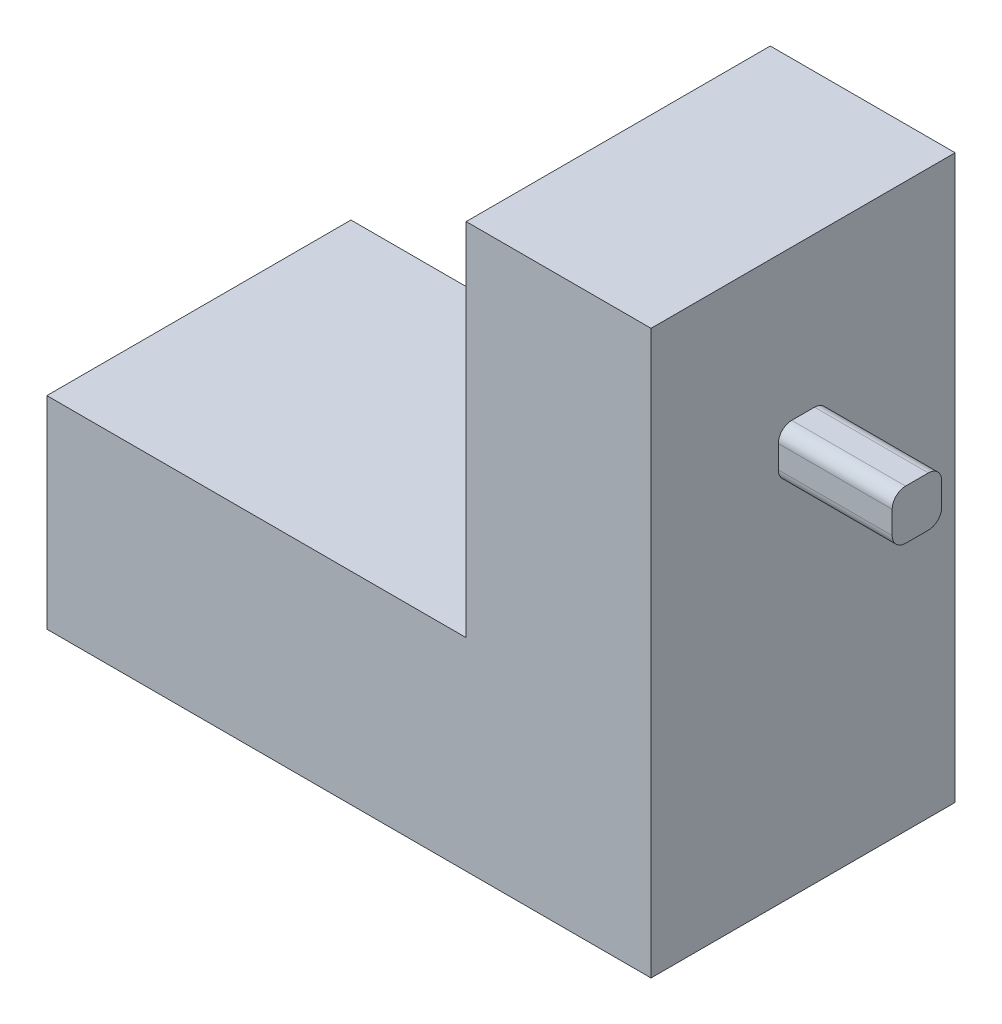
ISO-10303-21;
HEADER;
FILE_DESCRIPTION(('STEP AP214'),'2;1');
FILE_NAME('part.step','',(''),(''),'','','');
FILE_SCHEMA(('AUTOMOTIVE_DESIGN { 1 0 10303 214 1 1 1 1 }'));
ENDSEC;
DATA;
#1=APPLICATION_CONTEXT('core data for automotive mechanical design processes');
#2=APPLICATION_PROTOCOL_DEFINITION('international standard','automotive_design',2000,#1);
#3=PRODUCT_CONTEXT('',#1,'mechanical');
#4=PRODUCT('Part','Part','',(#3));
#5=PRODUCT_RELATED_PRODUCT_CATEGORY('part','',(#4));
#6=PRODUCT_DEFINITION_FORMATION('','',#4);
#7=PRODUCT_DEFINITION_CONTEXT('part definition',#1,'design');
#8=PRODUCT_DEFINITION('design','',#6,#7);
#9=PRODUCT_DEFINITION_SHAPE('','',#8);
#10=(LENGTH_UNIT() NAMED_UNIT(*) SI_UNIT(.MILLI.,.METRE.));
#11=(NAMED_UNIT(*) PLANE_ANGLE_UNIT() SI_UNIT($,.RADIAN.));
#12=(NAMED_UNIT(*) SI_UNIT($,.STERADIAN.) SOLID_ANGLE_UNIT());
#13=UNCERTAINTY_MEASURE_WITH_UNIT(LENGTH_MEASURE(1.E-05),#10,'distance_accuracy_value','');
#14=(GEOMETRIC_REPRESENTATION_CONTEXT(3) GLOBAL_UNCERTAINTY_ASSIGNED_CONTEXT((#13)) GLOBAL_UNIT_ASSIGNED_CONTEXT((#10,
#11,#12)) REPRESENTATION_CONTEXT('',''));
#15=CARTESIAN_POINT('',(0.,0.,0.));
#16=DIRECTION('',(0.,0.,1.));
#17=DIRECTION('',(1.,0.,0.));
#18=AXIS2_PLACEMENT_3D('',#15,#16,#17);
#19=CARTESIAN_POINT('',(-6.94397744138555,25.5552538240955,22.7));
#20=DIRECTION('',(0.,1.,0.));
#21=DIRECTION('',(0.,0.,1.));
#22=AXIS2_PLACEMENT_3D('',#19,#20,#21);
#23=PLANE('',#22);
#24=DIRECTION('',(0.,0.,-1.));
#25=VECTOR('',#24,1.);
#26=CARTESIAN_POINT('',(-6.94397744138555,25.5552538240955,22.7));
#27=LINE('',#26,#25);
#28=CARTESIAN_POINT('',(-6.94397744138555,25.5552538240955,12.2));
#29=VERTEX_POINT('',#28);
#30=CARTESIAN_POINT('',(-6.94397744138555,25.5552538240955,10.5));
#31=VERTEX_POINT('',#30);
#32=EDGE_CURVE('E198',#29,#31,#27,.T.);
#33=ORIENTED_EDGE('',*,*,#32,.T.);
#34=DIRECTION('',(1.,0.,0.));
#35=VECTOR('',#34,1.);
#36=CARTESIAN_POINT('',(-6.94397744138555,25.5552538240955,10.5));
#37=LINE('',#36,#35);
#38=CARTESIAN_POINT('',(1.55602255861446,25.5552538240955,10.5));
#39=VERTEX_POINT('',#38);
#40=EDGE_CURVE('E182',#31,#39,#37,.T.);
#41=ORIENTED_EDGE('',*,*,#40,.T.);
#42=DIRECTION('',(0.,0.,-1.));
#43=VECTOR('',#42,1.);
#44=CARTESIAN_POINT('',(1.55602255861446,25.5552538240955,22.7));
#45=LINE('',#44,#43);
#46=CARTESIAN_POINT('',(1.55602255861446,25.5552538240955,12.2));
#47=VERTEX_POINT('',#46);
#48=EDGE_CURVE('E208',#47,#39,#45,.T.);
#49=ORIENTED_EDGE('',*,*,#48,.F.);
#50=DIRECTION('',(1.,0.,0.));
#51=VECTOR('',#50,1.);
#52=CARTESIAN_POINT('',(-6.94397744138554,25.5552538240955,12.2));
#53=LINE('',#52,#51);
#54=EDGE_CURVE('E180',#47,#29,#53,.F.);
#55=ORIENTED_EDGE('',*,*,#54,.T.);
#56=EDGE_LOOP('',(#33,#41,#49,#55));
#57=FACE_BOUND('',#56,.T.);
#58=ADVANCED_FACE('F32',(#57),#23,.F.);
#59=CARTESIAN_POINT('',(1.55602255861446,25.5552538240955,22.7));
#60=DIRECTION('',(-1.,0.,0.));
#61=DIRECTION('',(0.,0.,1.));
#62=AXIS2_PLACEMENT_3D('',#59,#60,#61);
#63=PLANE('',#62);
#64=DIRECTION('',(0.,1.,0.));
#65=VECTOR('',#64,1.);
#66=CARTESIAN_POINT('',(1.55602255861446,25.5552538240955,9.5));
#67=LINE('',#66,#65);
#68=CARTESIAN_POINT('',(1.55602255861446,26.5552538240955,9.5));
#69=VERTEX_POINT('',#68);
#70=CARTESIAN_POINT('',(1.55602255861446,28.2552538240955,9.5));
#71=VERTEX_POINT('',#70);
#72=EDGE_CURVE('E215',#69,#71,#67,.T.);
#73=ORIENTED_EDGE('',*,*,#72,.T.);
#74=CARTESIAN_POINT('',(1.55602255861446,28.2552538240955,10.5));
#75=DIRECTION('',(-1.,0.,0.));
#76=DIRECTION('',(0.,0.,1.));
#77=AXIS2_PLACEMENT_3D('',#74,#75,#76);
#78=CIRCLE('',#77,1.);
#79=CARTESIAN_POINT('',(1.55602255861446,29.2552538240955,10.5));
#80=VERTEX_POINT('',#79);
#81=EDGE_CURVE('E174',#71,#80,#78,.F.);
#82=ORIENTED_EDGE('',*,*,#81,.T.);
#83=DIRECTION('',(0.,0.,-1.));
#84=VECTOR('',#83,1.);
#85=CARTESIAN_POINT('',(1.55602255861446,29.2552538240955,22.7));
#86=LINE('',#85,#84);
#87=CARTESIAN_POINT('',(1.55602255861446,29.2552538240955,12.2));
#88=VERTEX_POINT('',#87);
#89=EDGE_CURVE('E255',#88,#80,#86,.T.);
#90=ORIENTED_EDGE('',*,*,#89,.F.);
#91=CARTESIAN_POINT('',(1.55602255861446,28.2552538240955,12.2));
#92=DIRECTION('',(-1.,0.,0.));
#93=DIRECTION('',(0.,0.,1.));
#94=AXIS2_PLACEMENT_3D('',#91,#92,#93);
#95=CIRCLE('',#94,1.);
#96=CARTESIAN_POINT('',(1.55602255861446,28.2552538240955,13.2));
#97=VERTEX_POINT('',#96);
#98=EDGE_CURVE('E168',#88,#97,#95,.F.);
#99=ORIENTED_EDGE('',*,*,#98,.T.);
#100=DIRECTION('',(0.,1.,0.));
#101=VECTOR('',#100,1.);
#102=CARTESIAN_POINT('',(1.55602255861446,29.2552538240955,13.2));
#103=LINE('',#102,#101);
#104=CARTESIAN_POINT('',(1.55602255861446,26.5552538240955,13.2));
#105=VERTEX_POINT('',#104);
#106=EDGE_CURVE('E221',#105,#97,#103,.T.);
#107=ORIENTED_EDGE('',*,*,#106,.F.);
#108=CARTESIAN_POINT('',(1.55602255861446,26.5552538240955,12.2));
#109=DIRECTION('',(-1.,0.,0.));
#110=DIRECTION('',(0.,0.,1.));
#111=AXIS2_PLACEMENT_3D('',#108,#109,#110);
#112=CIRCLE('',#111,1.);
#113=EDGE_CURVE('E170',#105,#47,#112,.F.);
#114=ORIENTED_EDGE('',*,*,#113,.T.);
#115=ORIENTED_EDGE('',*,*,#48,.T.);
#116=CARTESIAN_POINT('',(1.55602255861446,26.5552538240955,10.5));
#117=DIRECTION('',(-1.,0.,0.));
#118=DIRECTION('',(0.,0.,1.));
#119=AXIS2_PLACEMENT_3D('',#116,#117,#118);
#120=CIRCLE('',#119,1.);
#121=EDGE_CURVE('E172',#39,#69,#120,.F.);
#122=ORIENTED_EDGE('',*,*,#121,.T.);
#123=EDGE_LOOP('',(#73,#82,#90,#99,#107,#114,#115,#122));
#124=FACE_BOUND('',#123,.T.);
#125=ADVANCED_FACE('F214',(#124),#63,.F.);
#126=CARTESIAN_POINT('',(1.55602255861446,29.2552538240955,22.7));
#127=DIRECTION('',(0.,-1.,0.));
#128=DIRECTION('',(0.,0.,-1.));
#129=AXIS2_PLACEMENT_3D('',#126,#127,#128);
#130=PLANE('',#129);
#131=ORIENTED_EDGE('',*,*,#89,.T.);
#132=DIRECTION('',(1.,0.,0.));
#133=VECTOR('',#132,1.);
#134=CARTESIAN_POINT('',(1.55602255861446,29.2552538240955,10.5));
#135=LINE('',#134,#133);
#136=CARTESIAN_POINT('',(-6.94397744138554,29.2552538240955,10.5));
#137=VERTEX_POINT('',#136);
#138=EDGE_CURVE('E178',#80,#137,#135,.F.);
#139=ORIENTED_EDGE('',*,*,#138,.T.);
#140=DIRECTION('',(0.,0.,-1.));
#141=VECTOR('',#140,1.);
#142=CARTESIAN_POINT('',(-6.94397744138554,29.2552538240955,22.7));
#143=LINE('',#142,#141);
#144=CARTESIAN_POINT('',(-6.94397744138554,29.2552538240955,12.2));
#145=VERTEX_POINT('',#144);
#146=EDGE_CURVE('E252',#145,#137,#143,.T.);
#147=ORIENTED_EDGE('',*,*,#146,.F.);
#148=DIRECTION('',(-1.,0.,0.));
#149=VECTOR('',#148,1.);
#150=CARTESIAN_POINT('',(1.55602255861446,29.2552538240955,12.2));
#151=LINE('',#150,#149);
#152=EDGE_CURVE('E176',#145,#88,#151,.F.);
#153=ORIENTED_EDGE('',*,*,#152,.T.);
#154=EDGE_LOOP('',(#131,#139,#147,#153));
#155=FACE_BOUND('',#154,.T.);
#156=ADVANCED_FACE('F289',(#155),#130,.F.);
#157=CARTESIAN_POINT('',(-20.7439774413855,13.5552538240955,22.7));
#158=DIRECTION('',(0.,-1.,0.));
#159=DIRECTION('',(1.,0.,0.));
#160=AXIS2_PLACEMENT_3D('',#157,#158,#159);
#161=PLANE('',#160);
#162=DIRECTION('',(-1.,0.,0.));
#163=VECTOR('',#162,1.);
#164=CARTESIAN_POINT('',(-20.7439774413855,13.5552538240955,0.));
#165=LINE('',#164,#163);
#166=CARTESIAN_POINT('',(-20.7439774413855,13.5552538240955,0.));
#167=VERTEX_POINT('',#166);
#168=CARTESIAN_POINT('',(-52.0439774413856,13.5552538240955,0.));
#169=VERTEX_POINT('',#168);
#170=EDGE_CURVE('E157',#167,#169,#165,.T.);
#171=ORIENTED_EDGE('',*,*,#170,.T.);
#172=DIRECTION('',(0.,0.,-1.));
#173=VECTOR('',#172,1.);
#174=CARTESIAN_POINT('',(-52.0439774413856,13.5552538240955,22.7));
#175=LINE('',#174,#173);
#176=CARTESIAN_POINT('',(-52.0439774413856,13.5552538240955,22.7));
#177=VERTEX_POINT('',#176);
#178=EDGE_CURVE('E137',#177,#169,#175,.T.);
#179=ORIENTED_EDGE('',*,*,#178,.F.);
#180=DIRECTION('',(-1.,0.,0.));
#181=VECTOR('',#180,1.);
#182=CARTESIAN_POINT('',(-20.7439774413855,13.5552538240955,22.7));
#183=LINE('',#182,#181);
#184=CARTESIAN_POINT('',(-20.7439774413855,13.5552538240955,22.7));
#185=VERTEX_POINT('',#184);
#186=EDGE_CURVE('E144',#185,#177,#183,.T.);
#187=ORIENTED_EDGE('',*,*,#186,.F.);
#188=DIRECTION('',(0.,0.,-1.));
#189=VECTOR('',#188,1.);
#190=CARTESIAN_POINT('',(-20.7439774413855,13.5552538240955,22.7));
#191=LINE('',#190,#189);
#192=EDGE_CURVE('E233',#185,#167,#191,.T.);
#193=ORIENTED_EDGE('',*,*,#192,.T.);
#194=EDGE_LOOP('',(#171,#179,#187,#193));
#195=FACE_BOUND('',#194,.T.);
#196=ADVANCED_FACE('F155',(#195),#161,.F.);
#197=CARTESIAN_POINT('',(-52.0439774413856,13.5552538240955,22.7));
#198=DIRECTION('',(1.,0.,0.));
#199=DIRECTION('',(0.,1.,0.));
#200=AXIS2_PLACEMENT_3D('',#197,#198,#199);
#201=PLANE('',#200);
#202=DIRECTION('',(0.,-1.,0.));
#203=VECTOR('',#202,1.);
#204=CARTESIAN_POINT('',(-52.0439774413856,13.5552538240955,0.));
#205=LINE('',#204,#203);
#206=CARTESIAN_POINT('',(-52.0439774413856,-1.54474617590453,0.));
#207=VERTEX_POINT('',#206);
#208=EDGE_CURVE('E235',#169,#207,#205,.T.);
#209=ORIENTED_EDGE('',*,*,#208,.T.);
#210=DIRECTION('',(0.,0.,-1.));
#211=VECTOR('',#210,1.);
#212=CARTESIAN_POINT('',(-52.0439774413856,-1.54474617590453,22.7));
#213=LINE('',#212,#211);
#214=CARTESIAN_POINT('',(-52.0439774413856,-1.54474617590453,22.7));
#215=VERTEX_POINT('',#214);
#216=EDGE_CURVE('E140',#215,#207,#213,.T.);
#217=ORIENTED_EDGE('',*,*,#216,.F.);
#218=DIRECTION('',(0.,-1.,0.));
#219=VECTOR('',#218,1.);
#220=CARTESIAN_POINT('',(-52.0439774413856,13.5552538240955,22.7));
#221=LINE('',#220,#219);
#222=EDGE_CURVE('E133',#177,#215,#221,.T.);
#223=ORIENTED_EDGE('',*,*,#222,.F.);
#224=ORIENTED_EDGE('',*,*,#178,.T.);
#225=EDGE_LOOP('',(#209,#217,#223,#224));
#226=FACE_BOUND('',#225,.T.);
#227=ADVANCED_FACE('F135',(#226),#201,.F.);
#228=CARTESIAN_POINT('',(-52.0439774413856,-1.54474617590453,22.7));
#229=DIRECTION('',(0.,1.,0.));
#230=DIRECTION('',(0.,0.,1.));
#231=AXIS2_PLACEMENT_3D('',#228,#229,#230);
#232=PLANE('',#231);
#233=DIRECTION('',(1.,0.,0.));
#234=VECTOR('',#233,1.);
#235=CARTESIAN_POINT('',(-52.0439774413856,-1.54474617590453,0.));
#236=LINE('',#235,#234);
#237=CARTESIAN_POINT('',(-6.94397744138554,-1.54474617590453,0.));
#238=VERTEX_POINT('',#237);
#239=EDGE_CURVE('E237',#207,#238,#236,.T.);
#240=ORIENTED_EDGE('',*,*,#239,.T.);
#241=DIRECTION('',(0.,0.,-1.));
#242=VECTOR('',#241,1.);
#243=CARTESIAN_POINT('',(-6.94397744138554,-1.54474617590453,22.7));
#244=LINE('',#243,#242);
#245=CARTESIAN_POINT('',(-6.94397744138554,-1.54474617590453,22.7));
#246=VERTEX_POINT('',#245);
#247=EDGE_CURVE('E162',#246,#238,#244,.T.);
#248=ORIENTED_EDGE('',*,*,#247,.F.);
#249=DIRECTION('',(1.,0.,0.));
#250=VECTOR('',#249,1.);
#251=CARTESIAN_POINT('',(-52.0439774413856,-1.54474617590453,22.7));
#252=LINE('',#251,#250);
#253=EDGE_CURVE('E143',#215,#246,#252,.T.);
#254=ORIENTED_EDGE('',*,*,#253,.F.);
#255=ORIENTED_EDGE('',*,*,#216,.T.);
#256=EDGE_LOOP('',(#240,#248,#254,#255));
#257=FACE_BOUND('',#256,.T.);
#258=ADVANCED_FACE('F263',(#257),#232,.F.);
#259=CARTESIAN_POINT('',(-6.94397744138554,29.2552538240955,22.7));
#260=DIRECTION('',(-1.,0.,0.));
#261=DIRECTION('',(0.,-1.,0.));
#262=AXIS2_PLACEMENT_3D('',#259,#260,#261);
#263=PLANE('',#262);
#264=DIRECTION('',(0.,1.,0.));
#265=VECTOR('',#264,1.);
#266=CARTESIAN_POINT('',(-6.94397744138554,29.2552538240955,9.5));
#267=LINE('',#266,#265);
#268=CARTESIAN_POINT('',(-6.94397744138554,26.5552538240955,9.5));
#269=VERTEX_POINT('',#268);
#270=CARTESIAN_POINT('',(-6.94397744138554,28.2552538240955,9.5));
#271=VERTEX_POINT('',#270);
#272=EDGE_CURVE('E200',#269,#271,#267,.T.);
#273=ORIENTED_EDGE('',*,*,#272,.F.);
#274=CARTESIAN_POINT('',(-6.94397744138554,26.5552538240955,10.5));
#275=DIRECTION('',(-1.,0.,0.));
#276=DIRECTION('',(0.,-1.,0.));
#277=AXIS2_PLACEMENT_3D('',#274,#275,#276);
#278=CIRCLE('',#277,1.);
#279=EDGE_CURVE('E192',#269,#31,#278,.T.);
#280=ORIENTED_EDGE('',*,*,#279,.T.);
#281=ORIENTED_EDGE('',*,*,#32,.F.);
#282=CARTESIAN_POINT('',(-6.94397744138554,26.5552538240955,12.2));
#283=DIRECTION('',(-1.,0.,0.));
#284=DIRECTION('',(0.,-1.,0.));
#285=AXIS2_PLACEMENT_3D('',#282,#283,#284);
#286=CIRCLE('',#285,1.);
#287=CARTESIAN_POINT('',(-6.94397744138554,26.5552538240955,13.2));
#288=VERTEX_POINT('',#287);
#289=EDGE_CURVE('E40',#29,#288,#286,.T.);
#290=ORIENTED_EDGE('',*,*,#289,.T.);
#291=DIRECTION('',(0.,-1.,0.));
#292=VECTOR('',#291,1.);
#293=CARTESIAN_POINT('',(-6.94397744138554,29.2552538240955,13.2));
#294=LINE('',#293,#292);
#295=CARTESIAN_POINT('',(-6.94397744138554,28.2552538240955,13.2));
#296=VERTEX_POINT('',#295);
#297=EDGE_CURVE('E219',#296,#288,#294,.T.);
#298=ORIENTED_EDGE('',*,*,#297,.F.);
#299=CARTESIAN_POINT('',(-6.94397744138554,28.2552538240955,12.2));
#300=DIRECTION('',(-1.,0.,0.));
#301=DIRECTION('',(0.,-1.,0.));
#302=AXIS2_PLACEMENT_3D('',#299,#300,#301);
#303=CIRCLE('',#302,1.);
#304=EDGE_CURVE('E11',#296,#145,#303,.T.);
#305=ORIENTED_EDGE('',*,*,#304,.T.);
#306=ORIENTED_EDGE('',*,*,#146,.T.);
#307=CARTESIAN_POINT('',(-6.94397744138554,28.2552538240955,10.5));
#308=DIRECTION('',(-1.,0.,0.));
#309=DIRECTION('',(0.,-1.,0.));
#310=AXIS2_PLACEMENT_3D('',#307,#308,#309);
#311=CIRCLE('',#310,1.);
#312=EDGE_CURVE('E190',#137,#271,#311,.T.);
#313=ORIENTED_EDGE('',*,*,#312,.T.);
#314=EDGE_LOOP('',(#273,#280,#281,#290,#298,#305,#306,#313));
#315=FACE_BOUND('',#314,.T.);
#316=ORIENTED_EDGE('',*,*,#247,.T.);
#317=DIRECTION('',(0.,1.,0.));
#318=VECTOR('',#317,1.);
#319=CARTESIAN_POINT('',(-6.94397744138554,29.2552538240955,0.));
#320=LINE('',#319,#318);
#321=CARTESIAN_POINT('',(-6.94397744138554,40.4552538240955,0.));
#322=VERTEX_POINT('',#321);
#323=EDGE_CURVE('E240',#238,#322,#320,.T.);
#324=ORIENTED_EDGE('',*,*,#323,.T.);
#325=DIRECTION('',(0.,0.,-1.));
#326=VECTOR('',#325,1.);
#327=CARTESIAN_POINT('',(-6.94397744138554,40.4552538240955,22.7));
#328=LINE('',#327,#326);
#329=CARTESIAN_POINT('',(-6.94397744138554,40.4552538240955,22.7));
#330=VERTEX_POINT('',#329);
#331=EDGE_CURVE('E249',#330,#322,#328,.T.);
#332=ORIENTED_EDGE('',*,*,#331,.F.);
#333=DIRECTION('',(0.,1.,0.));
#334=VECTOR('',#333,1.);
#335=CARTESIAN_POINT('',(-6.94397744138554,-1.54474617590453,22.7));
#336=LINE('',#335,#334);
#337=EDGE_CURVE('E228',#246,#330,#336,.T.);
#338=ORIENTED_EDGE('',*,*,#337,.F.);
#339=EDGE_LOOP('',(#316,#324,#332,#338));
#340=FACE_BOUND('',#339,.T.);
#341=ADVANCED_FACE('F196',(#315,#340),#263,.F.);
#342=CARTESIAN_POINT('',(-6.94397744138554,40.4552538240955,22.7));
#343=DIRECTION('',(0.,-1.,0.));
#344=DIRECTION('',(0.,0.,-1.));
#345=AXIS2_PLACEMENT_3D('',#342,#343,#344);
#346=PLANE('',#345);
#347=DIRECTION('',(-1.,0.,0.));
#348=VECTOR('',#347,1.);
#349=CARTESIAN_POINT('',(-6.94397744138554,40.4552538240955,0.));
#350=LINE('',#349,#348);
#351=CARTESIAN_POINT('',(-20.7439774413855,40.4552538240955,0.));
#352=VERTEX_POINT('',#351);
#353=EDGE_CURVE('E242',#322,#352,#350,.T.);
#354=ORIENTED_EDGE('',*,*,#353,.T.);
#355=DIRECTION('',(0.,0.,-1.));
#356=VECTOR('',#355,1.);
#357=CARTESIAN_POINT('',(-20.7439774413855,40.4552538240955,22.7));
#358=LINE('',#357,#356);
#359=CARTESIAN_POINT('',(-20.7439774413855,40.4552538240955,22.7));
#360=VERTEX_POINT('',#359);
#361=EDGE_CURVE('E246',#360,#352,#358,.T.);
#362=ORIENTED_EDGE('',*,*,#361,.F.);
#363=DIRECTION('',(-1.,0.,0.));
#364=VECTOR('',#363,1.);
#365=CARTESIAN_POINT('',(-6.94397744138554,40.4552538240955,22.7));
#366=LINE('',#365,#364);
#367=EDGE_CURVE('E230',#330,#360,#366,.T.);
#368=ORIENTED_EDGE('',*,*,#367,.F.);
#369=ORIENTED_EDGE('',*,*,#331,.T.);
#370=EDGE_LOOP('',(#354,#362,#368,#369));
#371=FACE_BOUND('',#370,.T.);
#372=ADVANCED_FACE('F271',(#371),#346,.F.);
#373=CARTESIAN_POINT('',(-20.7439774413855,40.4552538240955,22.7));
#374=DIRECTION('',(1.,0.,0.));
#375=DIRECTION('',(0.,1.,0.));
#376=AXIS2_PLACEMENT_3D('',#373,#374,#375);
#377=PLANE('',#376);
#378=DIRECTION('',(0.,-1.,0.));
#379=VECTOR('',#378,1.);
#380=CARTESIAN_POINT('',(-20.7439774413855,40.4552538240955,0.));
#381=LINE('',#380,#379);
#382=EDGE_CURVE('E153',#352,#167,#381,.T.);
#383=ORIENTED_EDGE('',*,*,#382,.T.);
#384=ORIENTED_EDGE('',*,*,#192,.F.);
#385=DIRECTION('',(0.,-1.,0.));
#386=VECTOR('',#385,1.);
#387=CARTESIAN_POINT('',(-20.7439774413855,40.4552538240955,22.7));
#388=LINE('',#387,#386);
#389=EDGE_CURVE('E149',#360,#185,#388,.T.);
#390=ORIENTED_EDGE('',*,*,#389,.F.);
#391=ORIENTED_EDGE('',*,*,#361,.T.);
#392=EDGE_LOOP('',(#383,#384,#390,#391));
#393=FACE_BOUND('',#392,.T.);
#394=ADVANCED_FACE('F274',(#393),#377,.F.);
#395=CARTESIAN_POINT('',(0.,0.,22.7));
#396=DIRECTION('',(0.,0.,1.));
#397=DIRECTION('',(1.,0.,0.));
#398=AXIS2_PLACEMENT_3D('',#395,#396,#397);
#399=PLANE('',#398);
#400=ORIENTED_EDGE('',*,*,#337,.T.);
#401=ORIENTED_EDGE('',*,*,#367,.T.);
#402=ORIENTED_EDGE('',*,*,#389,.T.);
#403=ORIENTED_EDGE('',*,*,#186,.T.);
#404=ORIENTED_EDGE('',*,*,#222,.T.);
#405=ORIENTED_EDGE('',*,*,#253,.T.);
#406=EDGE_LOOP('',(#400,#401,#402,#403,#404,#405));
#407=FACE_BOUND('',#406,.T.);
#408=ADVANCED_FACE('F147',(#407),#399,.T.);
#409=CARTESIAN_POINT('',(0.,0.,0.));
#410=DIRECTION('',(0.,0.,1.));
#411=DIRECTION('',(1.,0.,0.));
#412=AXIS2_PLACEMENT_3D('',#409,#410,#411);
#413=PLANE('',#412);
#414=ORIENTED_EDGE('',*,*,#323,.F.);
#415=ORIENTED_EDGE('',*,*,#239,.F.);
#416=ORIENTED_EDGE('',*,*,#208,.F.);
#417=ORIENTED_EDGE('',*,*,#170,.F.);
#418=ORIENTED_EDGE('',*,*,#382,.F.);
#419=ORIENTED_EDGE('',*,*,#353,.F.);
#420=EDGE_LOOP('',(#414,#415,#416,#417,#418,#419));
#421=FACE_BOUND('',#420,.T.);
#422=ADVANCED_FACE('F266',(#421),#413,.F.);
#423=CARTESIAN_POINT('',(0.,0.,13.2));
#424=DIRECTION('',(0.,0.,1.));
#425=DIRECTION('',(1.,0.,0.));
#426=AXIS2_PLACEMENT_3D('',#423,#424,#425);
#427=PLANE('',#426);
#428=ORIENTED_EDGE('',*,*,#297,.T.);
#429=DIRECTION('',(1.,0.,0.));
#430=VECTOR('',#429,1.);
#431=CARTESIAN_POINT('',(1.55602255861446,26.5552538240955,13.2));
#432=LINE('',#431,#430);
#433=EDGE_CURVE('E187',#288,#105,#432,.T.);
#434=ORIENTED_EDGE('',*,*,#433,.T.);
#435=ORIENTED_EDGE('',*,*,#106,.T.);
#436=DIRECTION('',(-1.,0.,0.));
#437=VECTOR('',#436,1.);
#438=CARTESIAN_POINT('',(-6.94397744138554,28.2552538240955,13.2));
#439=LINE('',#438,#437);
#440=EDGE_CURVE('E185',#97,#296,#439,.T.);
#441=ORIENTED_EDGE('',*,*,#440,.T.);
#442=EDGE_LOOP('',(#428,#434,#435,#441));
#443=FACE_BOUND('',#442,.T.);
#444=ADVANCED_FACE('F313',(#443),#427,.T.);
#445=CARTESIAN_POINT('',(0.,0.,9.5));
#446=DIRECTION('',(0.,0.,1.));
#447=DIRECTION('',(1.,0.,0.));
#448=AXIS2_PLACEMENT_3D('',#445,#446,#447);
#449=PLANE('',#448);
#450=ORIENTED_EDGE('',*,*,#272,.T.);
#451=DIRECTION('',(1.,0.,0.));
#452=VECTOR('',#451,1.);
#453=CARTESIAN_POINT('',(0.,28.2552538240955,9.5));
#454=LINE('',#453,#452);
#455=EDGE_CURVE('E160',#271,#71,#454,.T.);
#456=ORIENTED_EDGE('',*,*,#455,.T.);
#457=ORIENTED_EDGE('',*,*,#72,.F.);
#458=DIRECTION('',(1.,0.,0.));
#459=VECTOR('',#458,1.);
#460=CARTESIAN_POINT('',(0.,26.5552538240955,9.5));
#461=LINE('',#460,#459);
#462=EDGE_CURVE('E158',#69,#269,#461,.F.);
#463=ORIENTED_EDGE('',*,*,#462,.T.);
#464=EDGE_LOOP('',(#450,#456,#457,#463));
#465=FACE_BOUND('',#464,.T.);
#466=ADVANCED_FACE('F217',(#465),#449,.F.);
#467=CARTESIAN_POINT('',(0.,28.2552538240955,10.5));
#468=DIRECTION('',(1.,0.,0.));
#469=DIRECTION('',(0.,0.,-1.));
#470=AXIS2_PLACEMENT_3D('',#467,#468,#469);
#471=CYLINDRICAL_SURFACE('',#470,1.);
#472=ORIENTED_EDGE('',*,*,#312,.F.);
#473=ORIENTED_EDGE('',*,*,#138,.F.);
#474=ORIENTED_EDGE('',*,*,#81,.F.);
#475=ORIENTED_EDGE('',*,*,#455,.F.);
#476=EDGE_LOOP('',(#472,#473,#474,#475));
#477=FACE_BOUND('',#476,.T.);
#478=ADVANCED_FACE('F299',(#477),#471,.T.);
#479=CARTESIAN_POINT('',(-6.94397744138555,26.5552538240955,10.5));
#480=DIRECTION('',(1.,0.,0.));
#481=DIRECTION('',(0.,0.,-1.));
#482=AXIS2_PLACEMENT_3D('',#479,#480,#481);
#483=CYLINDRICAL_SURFACE('',#482,1.);
#484=ORIENTED_EDGE('',*,*,#279,.F.);
#485=ORIENTED_EDGE('',*,*,#462,.F.);
#486=ORIENTED_EDGE('',*,*,#121,.F.);
#487=ORIENTED_EDGE('',*,*,#40,.F.);
#488=EDGE_LOOP('',(#484,#485,#486,#487));
#489=FACE_BOUND('',#488,.T.);
#490=ADVANCED_FACE('F210',(#489),#483,.T.);
#491=CARTESIAN_POINT('',(0.,26.5552538240955,12.2));
#492=DIRECTION('',(-1.,0.,0.));
#493=DIRECTION('',(0.,0.,1.));
#494=AXIS2_PLACEMENT_3D('',#491,#492,#493);
#495=CYLINDRICAL_SURFACE('',#494,1.);
#496=ORIENTED_EDGE('',*,*,#289,.F.);
#497=ORIENTED_EDGE('',*,*,#54,.F.);
#498=ORIENTED_EDGE('',*,*,#113,.F.);
#499=ORIENTED_EDGE('',*,*,#433,.F.);
#500=EDGE_LOOP('',(#496,#497,#498,#499));
#501=FACE_BOUND('',#500,.T.);
#502=ADVANCED_FACE('F304',(#501),#495,.T.);
#503=CARTESIAN_POINT('',(0.,28.2552538240955,12.2));
#504=DIRECTION('',(1.,0.,0.));
#505=DIRECTION('',(0.,0.,-1.));
#506=AXIS2_PLACEMENT_3D('',#503,#504,#505);
#507=CYLINDRICAL_SURFACE('',#506,1.);
#508=ORIENTED_EDGE('',*,*,#98,.F.);
#509=ORIENTED_EDGE('',*,*,#152,.F.);
#510=ORIENTED_EDGE('',*,*,#304,.F.);
#511=ORIENTED_EDGE('',*,*,#440,.F.);
#512=EDGE_LOOP('',(#508,#509,#510,#511));
#513=FACE_BOUND('',#512,.T.);
#514=ADVANCED_FACE('F34',(#513),#507,.T.);
#515=CLOSED_SHELL('',(#58,#125,#156,#196,#227,#258,#341,#372,#394,#408,#422,#444,#466,#478,#490,
#502,#514));
#516=MANIFOLD_SOLID_BREP('B2',#515);
#517=ADVANCED_BREP_SHAPE_REPRESENTATION('',(#18,#516),#14);
#518=SHAPE_DEFINITION_REPRESENTATION(#9,#517);
ENDSEC;
END-ISO-10303-21;
